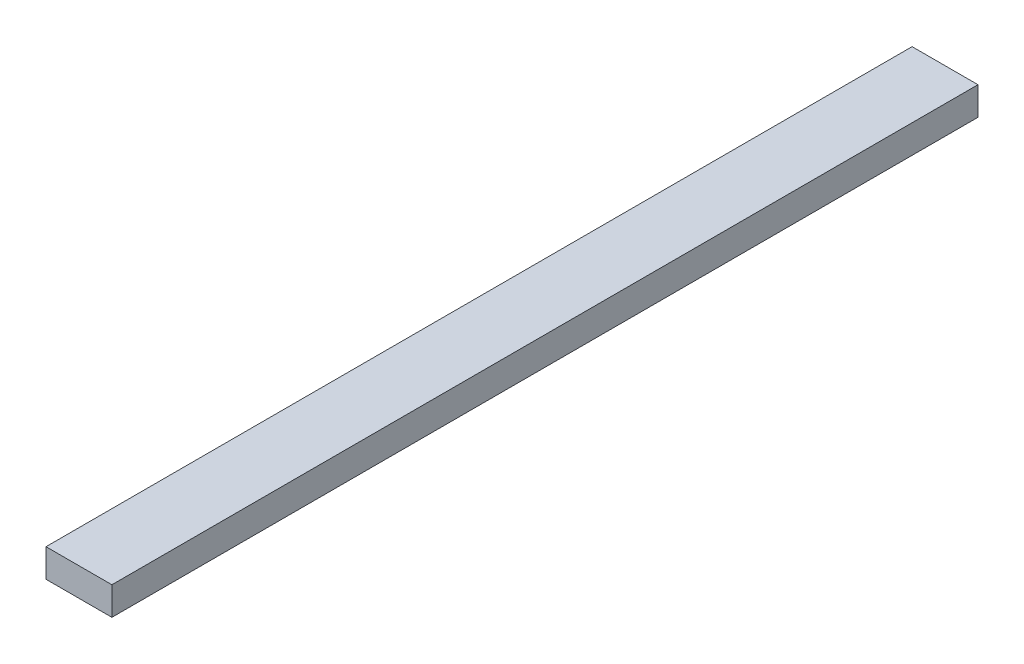
ISO-10303-21;
HEADER;
FILE_DESCRIPTION(('STEP AP214'),'2;1');
FILE_NAME('part.step','',(''),(''),'','','');
FILE_SCHEMA(('AUTOMOTIVE_DESIGN { 1 0 10303 214 1 1 1 1 }'));
ENDSEC;
DATA;
#1=APPLICATION_CONTEXT('core data for automotive mechanical design processes');
#2=APPLICATION_PROTOCOL_DEFINITION('international standard','automotive_design',2000,#1);
#3=PRODUCT_CONTEXT('',#1,'mechanical');
#4=PRODUCT('Part','Part','',(#3));
#5=PRODUCT_RELATED_PRODUCT_CATEGORY('part','',(#4));
#6=PRODUCT_DEFINITION_FORMATION('','',#4);
#7=PRODUCT_DEFINITION_CONTEXT('part definition',#1,'design');
#8=PRODUCT_DEFINITION('design','',#6,#7);
#9=PRODUCT_DEFINITION_SHAPE('','',#8);
#10=(LENGTH_UNIT() NAMED_UNIT(*) SI_UNIT(.MILLI.,.METRE.));
#11=(NAMED_UNIT(*) PLANE_ANGLE_UNIT() SI_UNIT($,.RADIAN.));
#12=(NAMED_UNIT(*) SI_UNIT($,.STERADIAN.) SOLID_ANGLE_UNIT());
#13=UNCERTAINTY_MEASURE_WITH_UNIT(LENGTH_MEASURE(1.E-05),#10,'distance_accuracy_value','');
#14=(GEOMETRIC_REPRESENTATION_CONTEXT(3) GLOBAL_UNCERTAINTY_ASSIGNED_CONTEXT((#13)) GLOBAL_UNIT_ASSIGNED_CONTEXT((#10,
#11,#12)) REPRESENTATION_CONTEXT('',''));
#15=CARTESIAN_POINT('',(0.,0.,0.));
#16=DIRECTION('',(0.,0.,1.));
#17=DIRECTION('',(1.,0.,0.));
#18=AXIS2_PLACEMENT_3D('',#15,#16,#17);
#19=CARTESIAN_POINT('',(-44.45,19.05,584.2));
#20=DIRECTION('',(1.,0.,0.));
#21=DIRECTION('',(0.,0.,-1.));
#22=AXIS2_PLACEMENT_3D('',#19,#20,#21);
#23=PLANE('',#22);
#24=DIRECTION('',(0.,-1.,0.));
#25=VECTOR('',#24,1.);
#26=CARTESIAN_POINT('',(-44.45,19.05,-584.2));
#27=LINE('',#26,#25);
#28=CARTESIAN_POINT('',(-44.45,19.05,-584.2));
#29=VERTEX_POINT('',#28);
#30=CARTESIAN_POINT('',(-44.45,-19.05,-584.2));
#31=VERTEX_POINT('',#30);
#32=EDGE_CURVE('E96',#29,#31,#27,.T.);
#33=ORIENTED_EDGE('',*,*,#32,.T.);
#34=DIRECTION('',(0.,0.,-1.));
#35=VECTOR('',#34,1.);
#36=CARTESIAN_POINT('',(-44.45,-19.05,584.2));
#37=LINE('',#36,#35);
#38=CARTESIAN_POINT('',(-44.45,-19.05,584.2));
#39=VERTEX_POINT('',#38);
#40=EDGE_CURVE('E11',#39,#31,#37,.T.);
#41=ORIENTED_EDGE('',*,*,#40,.F.);
#42=DIRECTION('',(0.,-1.,0.));
#43=VECTOR('',#42,1.);
#44=CARTESIAN_POINT('',(-44.45,19.05,584.2));
#45=LINE('',#44,#43);
#46=CARTESIAN_POINT('',(-44.45,19.05,584.2));
#47=VERTEX_POINT('',#46);
#48=EDGE_CURVE('E84',#47,#39,#45,.T.);
#49=ORIENTED_EDGE('',*,*,#48,.F.);
#50=DIRECTION('',(0.,0.,-1.));
#51=VECTOR('',#50,1.);
#52=CARTESIAN_POINT('',(-44.45,19.05,584.2));
#53=LINE('',#52,#51);
#54=EDGE_CURVE('E92',#47,#29,#53,.T.);
#55=ORIENTED_EDGE('',*,*,#54,.T.);
#56=EDGE_LOOP('',(#33,#41,#49,#55));
#57=FACE_BOUND('',#56,.T.);
#58=ADVANCED_FACE('F33',(#57),#23,.F.);
#59=CARTESIAN_POINT('',(44.45,-19.05,584.2));
#60=DIRECTION('',(0.,1.,0.));
#61=DIRECTION('',(-1.,0.,0.));
#62=AXIS2_PLACEMENT_3D('',#59,#60,#61);
#63=PLANE('',#62);
#64=DIRECTION('',(1.,0.,0.));
#65=VECTOR('',#64,1.);
#66=CARTESIAN_POINT('',(44.45,-19.05,-584.2));
#67=LINE('',#66,#65);
#68=CARTESIAN_POINT('',(44.45,-19.05,-584.2));
#69=VERTEX_POINT('',#68);
#70=EDGE_CURVE('E88',#31,#69,#67,.T.);
#71=ORIENTED_EDGE('',*,*,#70,.T.);
#72=DIRECTION('',(0.,0.,-1.));
#73=VECTOR('',#72,1.);
#74=CARTESIAN_POINT('',(44.45,-19.05,584.2));
#75=LINE('',#74,#73);
#76=CARTESIAN_POINT('',(44.45,-19.05,584.2));
#77=VERTEX_POINT('',#76);
#78=EDGE_CURVE('E41',#77,#69,#75,.T.);
#79=ORIENTED_EDGE('',*,*,#78,.F.);
#80=DIRECTION('',(1.,0.,0.));
#81=VECTOR('',#80,1.);
#82=CARTESIAN_POINT('',(44.45,-19.05,584.2));
#83=LINE('',#82,#81);
#84=EDGE_CURVE('E79',#39,#77,#83,.T.);
#85=ORIENTED_EDGE('',*,*,#84,.F.);
#86=ORIENTED_EDGE('',*,*,#40,.T.);
#87=EDGE_LOOP('',(#71,#79,#85,#86));
#88=FACE_BOUND('',#87,.T.);
#89=ADVANCED_FACE('F87',(#88),#63,.F.);
#90=CARTESIAN_POINT('',(44.45,19.05,584.2));
#91=DIRECTION('',(-1.,0.,0.));
#92=DIRECTION('',(0.,-1.,0.));
#93=AXIS2_PLACEMENT_3D('',#90,#91,#92);
#94=PLANE('',#93);
#95=DIRECTION('',(0.,1.,0.));
#96=VECTOR('',#95,1.);
#97=CARTESIAN_POINT('',(44.45,19.05,-584.2));
#98=LINE('',#97,#96);
#99=CARTESIAN_POINT('',(44.45,19.05,-584.2));
#100=VERTEX_POINT('',#99);
#101=EDGE_CURVE('E66',#69,#100,#98,.T.);
#102=ORIENTED_EDGE('',*,*,#101,.T.);
#103=DIRECTION('',(0.,0.,-1.));
#104=VECTOR('',#103,1.);
#105=CARTESIAN_POINT('',(44.45,19.05,584.2));
#106=LINE('',#105,#104);
#107=CARTESIAN_POINT('',(44.45,19.05,584.2));
#108=VERTEX_POINT('',#107);
#109=EDGE_CURVE('E89',#108,#100,#106,.T.);
#110=ORIENTED_EDGE('',*,*,#109,.F.);
#111=DIRECTION('',(0.,1.,0.));
#112=VECTOR('',#111,1.);
#113=CARTESIAN_POINT('',(44.45,19.05,584.2));
#114=LINE('',#113,#112);
#115=EDGE_CURVE('E82',#77,#108,#114,.T.);
#116=ORIENTED_EDGE('',*,*,#115,.F.);
#117=ORIENTED_EDGE('',*,*,#78,.T.);
#118=EDGE_LOOP('',(#102,#110,#116,#117));
#119=FACE_BOUND('',#118,.T.);
#120=ADVANCED_FACE('F90',(#119),#94,.F.);
#121=CARTESIAN_POINT('',(44.45,19.05,584.2));
#122=DIRECTION('',(0.,-1.,0.));
#123=DIRECTION('',(1.,0.,0.));
#124=AXIS2_PLACEMENT_3D('',#121,#122,#123);
#125=PLANE('',#124);
#126=DIRECTION('',(-1.,0.,0.));
#127=VECTOR('',#126,1.);
#128=CARTESIAN_POINT('',(44.45,19.05,-584.2));
#129=LINE('',#128,#127);
#130=EDGE_CURVE('E72',#100,#29,#129,.T.);
#131=ORIENTED_EDGE('',*,*,#130,.T.);
#132=ORIENTED_EDGE('',*,*,#54,.F.);
#133=DIRECTION('',(-1.,0.,0.));
#134=VECTOR('',#133,1.);
#135=CARTESIAN_POINT('',(44.45,19.05,584.2));
#136=LINE('',#135,#134);
#137=EDGE_CURVE('E49',#108,#47,#136,.T.);
#138=ORIENTED_EDGE('',*,*,#137,.F.);
#139=ORIENTED_EDGE('',*,*,#109,.T.);
#140=EDGE_LOOP('',(#131,#132,#138,#139));
#141=FACE_BOUND('',#140,.T.);
#142=ADVANCED_FACE('F103',(#141),#125,.F.);
#143=CARTESIAN_POINT('',(0.,0.,584.2));
#144=DIRECTION('',(0.,0.,-1.));
#145=DIRECTION('',(-1.,0.,0.));
#146=AXIS2_PLACEMENT_3D('',#143,#144,#145);
#147=PLANE('',#146);
#148=ORIENTED_EDGE('',*,*,#48,.T.);
#149=ORIENTED_EDGE('',*,*,#84,.T.);
#150=ORIENTED_EDGE('',*,*,#115,.T.);
#151=ORIENTED_EDGE('',*,*,#137,.T.);
#152=EDGE_LOOP('',(#148,#149,#150,#151));
#153=FACE_BOUND('',#152,.T.);
#154=ADVANCED_FACE('F80',(#153),#147,.F.);
#155=CARTESIAN_POINT('',(0.,0.,-584.2));
#156=DIRECTION('',(0.,0.,-1.));
#157=DIRECTION('',(-1.,0.,0.));
#158=AXIS2_PLACEMENT_3D('',#155,#156,#157);
#159=PLANE('',#158);
#160=ORIENTED_EDGE('',*,*,#32,.F.);
#161=ORIENTED_EDGE('',*,*,#130,.F.);
#162=ORIENTED_EDGE('',*,*,#101,.F.);
#163=ORIENTED_EDGE('',*,*,#70,.F.);
#164=EDGE_LOOP('',(#160,#161,#162,#163));
#165=FACE_BOUND('',#164,.T.);
#166=ADVANCED_FACE('F106',(#165),#159,.T.);
#167=CLOSED_SHELL('',(#58,#89,#120,#142,#154,#166));
#168=MANIFOLD_SOLID_BREP('B2',#167);
#169=ADVANCED_BREP_SHAPE_REPRESENTATION('',(#18,#168),#14);
#170=SHAPE_DEFINITION_REPRESENTATION(#9,#169);
ENDSEC;
END-ISO-10303-21;
